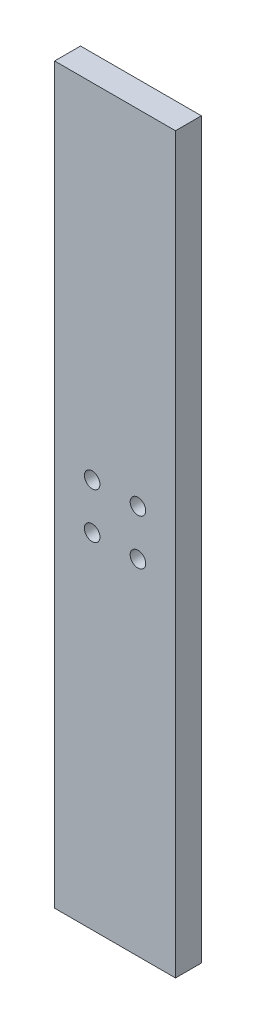
ISO-10303-21;
HEADER;
FILE_DESCRIPTION(('STEP AP214'),'2;1');
FILE_NAME('part.step','',(''),(''),'','','');
FILE_SCHEMA(('AUTOMOTIVE_DESIGN { 1 0 10303 214 1 1 1 1 }'));
ENDSEC;
DATA;
#1=APPLICATION_CONTEXT('core data for automotive mechanical design processes');
#2=APPLICATION_PROTOCOL_DEFINITION('international standard','automotive_design',2000,#1);
#3=PRODUCT_CONTEXT('',#1,'mechanical');
#4=PRODUCT('Part','Part','',(#3));
#5=PRODUCT_RELATED_PRODUCT_CATEGORY('part','',(#4));
#6=PRODUCT_DEFINITION_FORMATION('','',#4);
#7=PRODUCT_DEFINITION_CONTEXT('part definition',#1,'design');
#8=PRODUCT_DEFINITION('design','',#6,#7);
#9=PRODUCT_DEFINITION_SHAPE('','',#8);
#10=(LENGTH_UNIT() NAMED_UNIT(*) SI_UNIT(.MILLI.,.METRE.));
#11=(NAMED_UNIT(*) PLANE_ANGLE_UNIT() SI_UNIT($,.RADIAN.));
#12=(NAMED_UNIT(*) SI_UNIT($,.STERADIAN.) SOLID_ANGLE_UNIT());
#13=UNCERTAINTY_MEASURE_WITH_UNIT(LENGTH_MEASURE(1.E-05),#10,'distance_accuracy_value','');
#14=(GEOMETRIC_REPRESENTATION_CONTEXT(3) GLOBAL_UNCERTAINTY_ASSIGNED_CONTEXT((#13)) GLOBAL_UNIT_ASSIGNED_CONTEXT((#10,
#11,#12)) REPRESENTATION_CONTEXT('',''));
#15=CARTESIAN_POINT('',(0.,0.,0.));
#16=DIRECTION('',(0.,0.,1.));
#17=DIRECTION('',(1.,0.,0.));
#18=AXIS2_PLACEMENT_3D('',#15,#16,#17);
#19=CARTESIAN_POINT('',(0.,-42.5,3.));
#20=DIRECTION('',(0.,1.,0.));
#21=DIRECTION('',(0.,0.,1.));
#22=AXIS2_PLACEMENT_3D('',#19,#20,#21);
#23=PLANE('',#22);
#24=DIRECTION('',(1.,0.,0.));
#25=VECTOR('',#24,1.);
#26=CARTESIAN_POINT('',(0.,-42.5,0.));
#27=LINE('',#26,#25);
#28=CARTESIAN_POINT('',(-7.,-42.5,0.));
#29=VERTEX_POINT('',#28);
#30=CARTESIAN_POINT('',(7.00000000000001,-42.5,0.));
#31=VERTEX_POINT('',#30);
#32=EDGE_CURVE('E110',#29,#31,#27,.T.);
#33=ORIENTED_EDGE('',*,*,#32,.T.);
#34=DIRECTION('',(0.,0.,-1.));
#35=VECTOR('',#34,1.);
#36=CARTESIAN_POINT('',(7.00000000000001,-42.5,3.));
#37=LINE('',#36,#35);
#38=CARTESIAN_POINT('',(7.00000000000001,-42.5,3.));
#39=VERTEX_POINT('',#38);
#40=EDGE_CURVE('E11',#39,#31,#37,.T.);
#41=ORIENTED_EDGE('',*,*,#40,.F.);
#42=DIRECTION('',(1.,0.,0.));
#43=VECTOR('',#42,1.);
#44=CARTESIAN_POINT('',(0.,-42.5,3.));
#45=LINE('',#44,#43);
#46=CARTESIAN_POINT('',(-7.,-42.5,3.));
#47=VERTEX_POINT('',#46);
#48=EDGE_CURVE('E75',#47,#39,#45,.T.);
#49=ORIENTED_EDGE('',*,*,#48,.F.);
#50=DIRECTION('',(0.,0.,-1.));
#51=VECTOR('',#50,1.);
#52=CARTESIAN_POINT('',(-7.,-42.5,3.));
#53=LINE('',#52,#51);
#54=EDGE_CURVE('E94',#47,#29,#53,.T.);
#55=ORIENTED_EDGE('',*,*,#54,.T.);
#56=EDGE_LOOP('',(#33,#41,#49,#55));
#57=FACE_BOUND('',#56,.T.);
#58=ADVANCED_FACE('F35',(#57),#23,.F.);
#59=CARTESIAN_POINT('',(7.,0.,3.));
#60=DIRECTION('',(1.,0.,0.));
#61=DIRECTION('',(0.,1.,0.));
#62=AXIS2_PLACEMENT_3D('',#59,#60,#61);
#63=PLANE('',#62);
#64=DIRECTION('',(0.,-1.,0.));
#65=VECTOR('',#64,1.);
#66=CARTESIAN_POINT('',(7.,0.,0.));
#67=LINE('',#66,#65);
#68=CARTESIAN_POINT('',(6.99999999999999,42.5,0.));
#69=VERTEX_POINT('',#68);
#70=EDGE_CURVE('E84',#69,#31,#67,.T.);
#71=ORIENTED_EDGE('',*,*,#70,.F.);
#72=DIRECTION('',(0.,0.,-1.));
#73=VECTOR('',#72,1.);
#74=CARTESIAN_POINT('',(6.99999999999999,42.5,3.));
#75=LINE('',#74,#73);
#76=CARTESIAN_POINT('',(6.99999999999999,42.5,3.));
#77=VERTEX_POINT('',#76);
#78=EDGE_CURVE('E44',#77,#69,#75,.T.);
#79=ORIENTED_EDGE('',*,*,#78,.F.);
#80=DIRECTION('',(0.,-1.,0.));
#81=VECTOR('',#80,1.);
#82=CARTESIAN_POINT('',(7.,0.,3.));
#83=LINE('',#82,#81);
#84=EDGE_CURVE('E82',#77,#39,#83,.T.);
#85=ORIENTED_EDGE('',*,*,#84,.T.);
#86=ORIENTED_EDGE('',*,*,#40,.T.);
#87=EDGE_LOOP('',(#71,#79,#85,#86));
#88=FACE_BOUND('',#87,.T.);
#89=ADVANCED_FACE('F81',(#88),#63,.T.);
#90=CARTESIAN_POINT('',(0.,42.5,3.));
#91=DIRECTION('',(0.,1.,0.));
#92=DIRECTION('',(0.,0.,1.));
#93=AXIS2_PLACEMENT_3D('',#90,#91,#92);
#94=PLANE('',#93);
#95=DIRECTION('',(1.,0.,0.));
#96=VECTOR('',#95,1.);
#97=CARTESIAN_POINT('',(0.,42.5,0.));
#98=LINE('',#97,#96);
#99=CARTESIAN_POINT('',(-7.00000000000001,42.5,0.));
#100=VERTEX_POINT('',#99);
#101=EDGE_CURVE('E114',#100,#69,#98,.T.);
#102=ORIENTED_EDGE('',*,*,#101,.F.);
#103=DIRECTION('',(0.,0.,-1.));
#104=VECTOR('',#103,1.);
#105=CARTESIAN_POINT('',(-7.00000000000001,42.5,3.));
#106=LINE('',#105,#104);
#107=CARTESIAN_POINT('',(-7.00000000000001,42.5,3.));
#108=VERTEX_POINT('',#107);
#109=EDGE_CURVE('E67',#108,#100,#106,.T.);
#110=ORIENTED_EDGE('',*,*,#109,.F.);
#111=DIRECTION('',(1.,0.,0.));
#112=VECTOR('',#111,1.);
#113=CARTESIAN_POINT('',(0.,42.5,3.));
#114=LINE('',#113,#112);
#115=EDGE_CURVE('E90',#108,#77,#114,.T.);
#116=ORIENTED_EDGE('',*,*,#115,.T.);
#117=ORIENTED_EDGE('',*,*,#78,.T.);
#118=EDGE_LOOP('',(#102,#110,#116,#117));
#119=FACE_BOUND('',#118,.T.);
#120=ADVANCED_FACE('F92',(#119),#94,.T.);
#121=CARTESIAN_POINT('',(2.65165042944955,-2.65165042944955,3.));
#122=DIRECTION('',(0.,0.,-1.));
#123=DIRECTION('',(-1.,0.,0.));
#124=AXIS2_PLACEMENT_3D('',#121,#122,#123);
#125=CYLINDRICAL_SURFACE('',#124,0.9);
#126=CARTESIAN_POINT('',(2.65165042944955,-2.65165042944955,3.));
#127=DIRECTION('',(0.,0.,1.));
#128=DIRECTION('',(1.,0.,0.));
#129=AXIS2_PLACEMENT_3D('',#126,#127,#128);
#130=CIRCLE('',#129,0.9);
#131=CARTESIAN_POINT('',(3.55165042944955,-2.65165042944955,3.));
#132=VERTEX_POINT('',#131);
#133=EDGE_CURVE('E171',#132,#132,#130,.T.);
#134=ORIENTED_EDGE('',*,*,#133,.T.);
#135=EDGE_LOOP('',(#134));
#136=FACE_BOUND('',#135,.T.);
#137=CARTESIAN_POINT('',(2.65165042944955,-2.65165042944955,0.));
#138=DIRECTION('',(0.,0.,1.));
#139=DIRECTION('',(1.,0.,0.));
#140=AXIS2_PLACEMENT_3D('',#137,#138,#139);
#141=CIRCLE('',#140,0.9);
#142=CARTESIAN_POINT('',(3.55165042944955,-2.65165042944955,0.));
#143=VERTEX_POINT('',#142);
#144=EDGE_CURVE('E107',#143,#143,#141,.T.);
#145=ORIENTED_EDGE('',*,*,#144,.F.);
#146=EDGE_LOOP('',(#145));
#147=FACE_BOUND('',#146,.T.);
#148=ADVANCED_FACE('F142',(#136,#147),#125,.F.);
#149=CARTESIAN_POINT('',(-2.65165042944956,-2.65165042944954,3.));
#150=DIRECTION('',(0.,0.,-1.));
#151=DIRECTION('',(-1.,0.,0.));
#152=AXIS2_PLACEMENT_3D('',#149,#150,#151);
#153=CYLINDRICAL_SURFACE('',#152,0.9);
#154=CARTESIAN_POINT('',(-2.65165042944956,-2.65165042944954,3.));
#155=DIRECTION('',(0.,0.,1.));
#156=DIRECTION('',(1.,0.,0.));
#157=AXIS2_PLACEMENT_3D('',#154,#155,#156);
#158=CIRCLE('',#157,0.9);
#159=CARTESIAN_POINT('',(-1.75165042944956,-2.65165042944954,3.));
#160=VERTEX_POINT('',#159);
#161=EDGE_CURVE('E168',#160,#160,#158,.T.);
#162=ORIENTED_EDGE('',*,*,#161,.T.);
#163=EDGE_LOOP('',(#162));
#164=FACE_BOUND('',#163,.T.);
#165=CARTESIAN_POINT('',(-2.65165042944956,-2.65165042944954,0.));
#166=DIRECTION('',(0.,0.,1.));
#167=DIRECTION('',(1.,0.,0.));
#168=AXIS2_PLACEMENT_3D('',#165,#166,#167);
#169=CIRCLE('',#168,0.9);
#170=CARTESIAN_POINT('',(-1.75165042944956,-2.65165042944954,0.));
#171=VERTEX_POINT('',#170);
#172=EDGE_CURVE('E104',#171,#171,#169,.T.);
#173=ORIENTED_EDGE('',*,*,#172,.F.);
#174=EDGE_LOOP('',(#173));
#175=FACE_BOUND('',#174,.T.);
#176=ADVANCED_FACE('F145',(#164,#175),#153,.F.);
#177=CARTESIAN_POINT('',(-2.65165042944954,2.65165042944957,3.));
#178=DIRECTION('',(0.,0.,-1.));
#179=DIRECTION('',(-1.,0.,0.));
#180=AXIS2_PLACEMENT_3D('',#177,#178,#179);
#181=CYLINDRICAL_SURFACE('',#180,0.9);
#182=CARTESIAN_POINT('',(-2.65165042944954,2.65165042944957,3.));
#183=DIRECTION('',(0.,0.,1.));
#184=DIRECTION('',(1.,0.,0.));
#185=AXIS2_PLACEMENT_3D('',#182,#183,#184);
#186=CIRCLE('',#185,0.9);
#187=CARTESIAN_POINT('',(-1.75165042944954,2.65165042944957,3.));
#188=VERTEX_POINT('',#187);
#189=EDGE_CURVE('E159',#188,#188,#186,.T.);
#190=ORIENTED_EDGE('',*,*,#189,.T.);
#191=EDGE_LOOP('',(#190));
#192=FACE_BOUND('',#191,.T.);
#193=CARTESIAN_POINT('',(-2.65165042944954,2.65165042944957,0.));
#194=DIRECTION('',(0.,0.,1.));
#195=DIRECTION('',(1.,0.,0.));
#196=AXIS2_PLACEMENT_3D('',#193,#194,#195);
#197=CIRCLE('',#196,0.9);
#198=CARTESIAN_POINT('',(-1.75165042944954,2.65165042944957,0.));
#199=VERTEX_POINT('',#198);
#200=EDGE_CURVE('E101',#199,#199,#197,.T.);
#201=ORIENTED_EDGE('',*,*,#200,.F.);
#202=EDGE_LOOP('',(#201));
#203=FACE_BOUND('',#202,.T.);
#204=ADVANCED_FACE('F148',(#192,#203),#181,.F.);
#205=CARTESIAN_POINT('',(2.65165042944958,2.65165042944953,3.));
#206=DIRECTION('',(0.,0.,-1.));
#207=DIRECTION('',(-1.,0.,0.));
#208=AXIS2_PLACEMENT_3D('',#205,#206,#207);
#209=CYLINDRICAL_SURFACE('',#208,0.9);
#210=CARTESIAN_POINT('',(2.65165042944958,2.65165042944953,3.));
#211=DIRECTION('',(0.,0.,1.));
#212=DIRECTION('',(1.,0.,0.));
#213=AXIS2_PLACEMENT_3D('',#210,#211,#212);
#214=CIRCLE('',#213,0.9);
#215=CARTESIAN_POINT('',(3.55165042944958,2.65165042944953,3.));
#216=VERTEX_POINT('',#215);
#217=EDGE_CURVE('E117',#216,#216,#214,.T.);
#218=ORIENTED_EDGE('',*,*,#217,.T.);
#219=EDGE_LOOP('',(#218));
#220=FACE_BOUND('',#219,.T.);
#221=CARTESIAN_POINT('',(2.65165042944958,2.65165042944953,0.));
#222=DIRECTION('',(0.,0.,1.));
#223=DIRECTION('',(1.,0.,0.));
#224=AXIS2_PLACEMENT_3D('',#221,#222,#223);
#225=CIRCLE('',#224,0.9);
#226=CARTESIAN_POINT('',(3.55165042944958,2.65165042944953,0.));
#227=VERTEX_POINT('',#226);
#228=EDGE_CURVE('E98',#227,#227,#225,.T.);
#229=ORIENTED_EDGE('',*,*,#228,.F.);
#230=EDGE_LOOP('',(#229));
#231=FACE_BOUND('',#230,.T.);
#232=ADVANCED_FACE('F37',(#220,#231),#209,.F.);
#233=CARTESIAN_POINT('',(-7.,0.,3.));
#234=DIRECTION('',(1.,0.,0.));
#235=DIRECTION('',(0.,1.,0.));
#236=AXIS2_PLACEMENT_3D('',#233,#234,#235);
#237=PLANE('',#236);
#238=DIRECTION('',(0.,-1.,0.));
#239=VECTOR('',#238,1.);
#240=CARTESIAN_POINT('',(-7.,0.,0.));
#241=LINE('',#240,#239);
#242=EDGE_CURVE('E70',#100,#29,#241,.T.);
#243=ORIENTED_EDGE('',*,*,#242,.T.);
#244=ORIENTED_EDGE('',*,*,#54,.F.);
#245=DIRECTION('',(0.,-1.,0.));
#246=VECTOR('',#245,1.);
#247=CARTESIAN_POINT('',(-7.,0.,3.));
#248=LINE('',#247,#246);
#249=EDGE_CURVE('E52',#108,#47,#248,.T.);
#250=ORIENTED_EDGE('',*,*,#249,.F.);
#251=ORIENTED_EDGE('',*,*,#109,.T.);
#252=EDGE_LOOP('',(#243,#244,#250,#251));
#253=FACE_BOUND('',#252,.T.);
#254=ADVANCED_FACE('F129',(#253),#237,.F.);
#255=CARTESIAN_POINT('',(0.,0.,3.));
#256=DIRECTION('',(0.,0.,1.));
#257=DIRECTION('',(1.,0.,0.));
#258=AXIS2_PLACEMENT_3D('',#255,#256,#257);
#259=PLANE('',#258);
#260=ORIENTED_EDGE('',*,*,#217,.F.);
#261=EDGE_LOOP('',(#260));
#262=FACE_BOUND('',#261,.T.);
#263=ORIENTED_EDGE('',*,*,#189,.F.);
#264=EDGE_LOOP('',(#263));
#265=FACE_BOUND('',#264,.T.);
#266=ORIENTED_EDGE('',*,*,#161,.F.);
#267=EDGE_LOOP('',(#266));
#268=FACE_BOUND('',#267,.T.);
#269=ORIENTED_EDGE('',*,*,#133,.F.);
#270=EDGE_LOOP('',(#269));
#271=FACE_BOUND('',#270,.T.);
#272=ORIENTED_EDGE('',*,*,#48,.T.);
#273=ORIENTED_EDGE('',*,*,#84,.F.);
#274=ORIENTED_EDGE('',*,*,#115,.F.);
#275=ORIENTED_EDGE('',*,*,#249,.T.);
#276=EDGE_LOOP('',(#272,#273,#274,#275));
#277=FACE_BOUND('',#276,.T.);
#278=ADVANCED_FACE('F89',(#262,#265,#268,#271,#277),#259,.T.);
#279=CARTESIAN_POINT('',(0.,0.,0.));
#280=DIRECTION('',(0.,0.,1.));
#281=DIRECTION('',(1.,0.,0.));
#282=AXIS2_PLACEMENT_3D('',#279,#280,#281);
#283=PLANE('',#282);
#284=ORIENTED_EDGE('',*,*,#228,.T.);
#285=EDGE_LOOP('',(#284));
#286=FACE_BOUND('',#285,.T.);
#287=ORIENTED_EDGE('',*,*,#200,.T.);
#288=EDGE_LOOP('',(#287));
#289=FACE_BOUND('',#288,.T.);
#290=ORIENTED_EDGE('',*,*,#172,.T.);
#291=EDGE_LOOP('',(#290));
#292=FACE_BOUND('',#291,.T.);
#293=ORIENTED_EDGE('',*,*,#144,.T.);
#294=EDGE_LOOP('',(#293));
#295=FACE_BOUND('',#294,.T.);
#296=ORIENTED_EDGE('',*,*,#32,.F.);
#297=ORIENTED_EDGE('',*,*,#242,.F.);
#298=ORIENTED_EDGE('',*,*,#101,.T.);
#299=ORIENTED_EDGE('',*,*,#70,.T.);
#300=EDGE_LOOP('',(#296,#297,#298,#299));
#301=FACE_BOUND('',#300,.T.);
#302=ADVANCED_FACE('F122',(#286,#289,#292,#295,#301),#283,.F.);
#303=CLOSED_SHELL('',(#58,#89,#120,#148,#176,#204,#232,#254,#278,#302));
#304=MANIFOLD_SOLID_BREP('B2',#303);
#305=ADVANCED_BREP_SHAPE_REPRESENTATION('',(#18,#304),#14);
#306=SHAPE_DEFINITION_REPRESENTATION(#9,#305);
ENDSEC;
END-ISO-10303-21;
